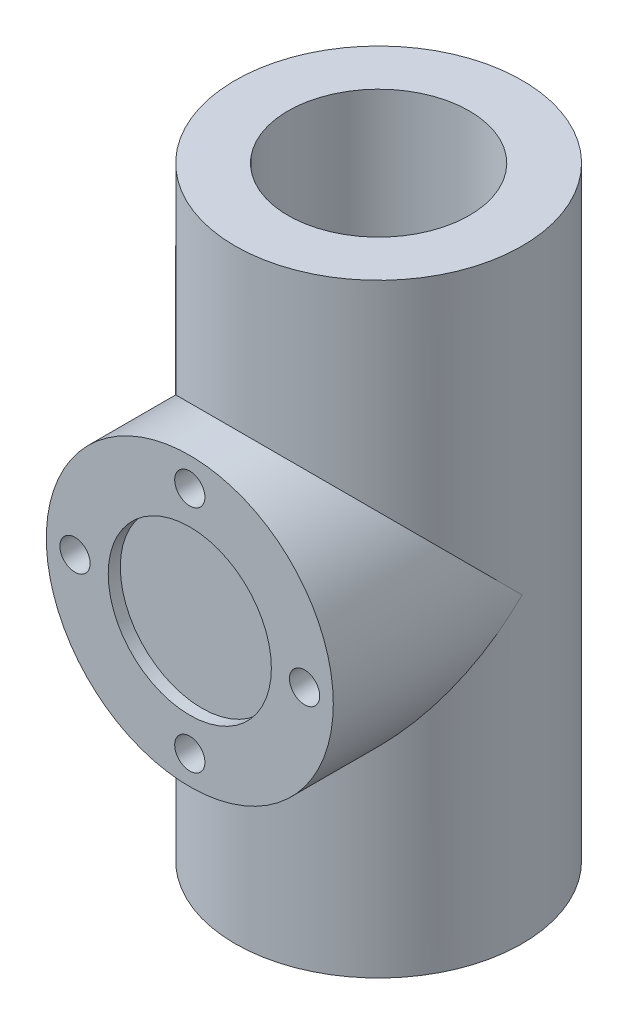
ISO-10303-21;
HEADER;
FILE_DESCRIPTION(('STEP AP214'),'2;1');
FILE_NAME('part.step','',(''),(''),'','','');
FILE_SCHEMA(('AUTOMOTIVE_DESIGN { 1 0 10303 214 1 1 1 1 }'));
ENDSEC;
DATA;
#1=APPLICATION_CONTEXT('core data for automotive mechanical design processes');
#2=APPLICATION_PROTOCOL_DEFINITION('international standard','automotive_design',2000,#1);
#3=PRODUCT_CONTEXT('',#1,'mechanical');
#4=PRODUCT('Part','Part','',(#3));
#5=PRODUCT_RELATED_PRODUCT_CATEGORY('part','',(#4));
#6=PRODUCT_DEFINITION_FORMATION('','',#4);
#7=PRODUCT_DEFINITION_CONTEXT('part definition',#1,'design');
#8=PRODUCT_DEFINITION('design','',#6,#7);
#9=PRODUCT_DEFINITION_SHAPE('','',#8);
#10=(LENGTH_UNIT() NAMED_UNIT(*) SI_UNIT(.MILLI.,.METRE.));
#11=(NAMED_UNIT(*) PLANE_ANGLE_UNIT() SI_UNIT($,.RADIAN.));
#12=(NAMED_UNIT(*) SI_UNIT($,.STERADIAN.) SOLID_ANGLE_UNIT());
#13=UNCERTAINTY_MEASURE_WITH_UNIT(LENGTH_MEASURE(1.E-05),#10,'distance_accuracy_value','');
#14=(GEOMETRIC_REPRESENTATION_CONTEXT(3) GLOBAL_UNCERTAINTY_ASSIGNED_CONTEXT((#13)) GLOBAL_UNIT_ASSIGNED_CONTEXT((#10,
#11,#12)) REPRESENTATION_CONTEXT('',''));
#15=CARTESIAN_POINT('',(0.,0.,0.));
#16=DIRECTION('',(0.,0.,1.));
#17=DIRECTION('',(1.,0.,0.));
#18=AXIS2_PLACEMENT_3D('',#15,#16,#17);
#19=CARTESIAN_POINT('',(0.,100.,0.));
#20=DIRECTION('',(0.,-1.,0.));
#21=DIRECTION('',(0.,0.,-1.));
#22=AXIS2_PLACEMENT_3D('',#19,#20,#21);
#23=CYLINDRICAL_SURFACE('',#22,47.5);
#24=CARTESIAN_POINT('',(0.,0.,0.));
#25=DIRECTION('',(0.,0.707106781186547,0.707106781186547));
#26=DIRECTION('',(0.,-0.707106781186547,0.707106781186547));
#27=AXIS2_PLACEMENT_3D('',#24,#25,#26);
#28=ELLIPSE('',#27,67.175144212722,47.5);
#29=CARTESIAN_POINT('',(-47.5,0.,0.));
#30=VERTEX_POINT('',#29);
#31=CARTESIAN_POINT('',(47.5,0.,0.));
#32=VERTEX_POINT('',#31);
#33=EDGE_CURVE('E60',#30,#32,#28,.T.);
#34=ORIENTED_EDGE('',*,*,#33,.F.);
#35=CARTESIAN_POINT('',(0.,0.,0.));
#36=DIRECTION('',(0.,-0.707106781186547,0.707106781186547));
#37=DIRECTION('',(0.,0.707106781186547,0.707106781186547));
#38=AXIS2_PLACEMENT_3D('',#35,#36,#37);
#39=ELLIPSE('',#38,67.175144212722,47.5);
#40=EDGE_CURVE('E58',#32,#30,#39,.T.);
#41=ORIENTED_EDGE('',*,*,#40,.F.);
#42=EDGE_LOOP('',(#34,#41));
#43=FACE_BOUND('',#42,.T.);
#44=CARTESIAN_POINT('',(0.,100.,0.));
#45=DIRECTION('',(0.,1.,0.));
#46=DIRECTION('',(0.,0.,1.));
#47=AXIS2_PLACEMENT_3D('',#44,#45,#46);
#48=CIRCLE('',#47,47.5);
#49=CARTESIAN_POINT('',(0.,100.,47.5));
#50=VERTEX_POINT('',#49);
#51=EDGE_CURVE('E11',#50,#50,#48,.T.);
#52=ORIENTED_EDGE('',*,*,#51,.F.);
#53=EDGE_LOOP('',(#52));
#54=FACE_BOUND('',#53,.T.);
#55=CARTESIAN_POINT('',(0.,-100.,0.));
#56=DIRECTION('',(0.,1.,0.));
#57=DIRECTION('',(0.,0.,1.));
#58=AXIS2_PLACEMENT_3D('',#55,#56,#57);
#59=CIRCLE('',#58,47.5);
#60=CARTESIAN_POINT('',(0.,-100.,47.5));
#61=VERTEX_POINT('',#60);
#62=EDGE_CURVE('E47',#61,#61,#59,.T.);
#63=ORIENTED_EDGE('',*,*,#62,.T.);
#64=EDGE_LOOP('',(#63));
#65=FACE_BOUND('',#64,.T.);
#66=ADVANCED_FACE('F44',(#43,#54,#65),#23,.T.);
#67=CARTESIAN_POINT('',(0.,100.,0.));
#68=DIRECTION('',(0.,1.,0.));
#69=DIRECTION('',(0.,0.,1.));
#70=AXIS2_PLACEMENT_3D('',#67,#68,#69);
#71=PLANE('',#70);
#72=CARTESIAN_POINT('',(0.,100.,0.));
#73=DIRECTION('',(0.,-1.,0.));
#74=DIRECTION('',(0.,0.,-1.));
#75=AXIS2_PLACEMENT_3D('',#72,#73,#74);
#76=CIRCLE('',#75,30.);
#77=CARTESIAN_POINT('',(0.,100.,-30.));
#78=VERTEX_POINT('',#77);
#79=EDGE_CURVE('E64',#78,#78,#76,.T.);
#80=ORIENTED_EDGE('',*,*,#79,.T.);
#81=EDGE_LOOP('',(#80));
#82=FACE_BOUND('',#81,.T.);
#83=ORIENTED_EDGE('',*,*,#51,.T.);
#84=EDGE_LOOP('',(#83));
#85=FACE_BOUND('',#84,.T.);
#86=ADVANCED_FACE('F154',(#82,#85),#71,.T.);
#87=CARTESIAN_POINT('',(0.,-100.,0.));
#88=DIRECTION('',(0.,1.,0.));
#89=DIRECTION('',(0.,0.,1.));
#90=AXIS2_PLACEMENT_3D('',#87,#88,#89);
#91=PLANE('',#90);
#92=CARTESIAN_POINT('',(0.,-100.,0.));
#93=DIRECTION('',(0.,-1.,0.));
#94=DIRECTION('',(0.,0.,-1.));
#95=AXIS2_PLACEMENT_3D('',#92,#93,#94);
#96=CIRCLE('',#95,30.);
#97=CARTESIAN_POINT('',(0.,-100.,-30.));
#98=VERTEX_POINT('',#97);
#99=EDGE_CURVE('E74',#98,#98,#96,.T.);
#100=ORIENTED_EDGE('',*,*,#99,.F.);
#101=EDGE_LOOP('',(#100));
#102=FACE_BOUND('',#101,.T.);
#103=ORIENTED_EDGE('',*,*,#62,.F.);
#104=EDGE_LOOP('',(#103));
#105=FACE_BOUND('',#104,.T.);
#106=ADVANCED_FACE('F147',(#102,#105),#91,.F.);
#107=CARTESIAN_POINT('',(0.,0.,-47.501));
#108=DIRECTION('',(0.,0.,1.));
#109=DIRECTION('',(1.,0.,0.));
#110=AXIS2_PLACEMENT_3D('',#107,#108,#109);
#111=CYLINDRICAL_SURFACE('',#110,47.5);
#112=CARTESIAN_POINT('',(0.,0.,62.5));
#113=DIRECTION('',(0.,0.,1.));
#114=DIRECTION('',(1.,0.,0.));
#115=AXIS2_PLACEMENT_3D('',#112,#113,#114);
#116=CIRCLE('',#115,47.5);
#117=CARTESIAN_POINT('',(47.5,0.,62.5));
#118=VERTEX_POINT('',#117);
#119=EDGE_CURVE('E68',#118,#118,#116,.T.);
#120=ORIENTED_EDGE('',*,*,#119,.F.);
#121=EDGE_LOOP('',(#120));
#122=FACE_BOUND('',#121,.T.);
#123=ORIENTED_EDGE('',*,*,#33,.T.);
#124=ORIENTED_EDGE('',*,*,#40,.T.);
#125=EDGE_LOOP('',(#123,#124));
#126=FACE_BOUND('',#125,.T.);
#127=ADVANCED_FACE('F61',(#122,#126),#111,.T.);
#128=CARTESIAN_POINT('',(0.,0.,62.5));
#129=DIRECTION('',(0.,0.,1.));
#130=DIRECTION('',(1.,0.,0.));
#131=AXIS2_PLACEMENT_3D('',#128,#129,#130);
#132=PLANE('',#131);
#133=CARTESIAN_POINT('',(0.,38.,62.5));
#134=DIRECTION('',(0.,0.,1.));
#135=DIRECTION('',(1.,0.,0.));
#136=AXIS2_PLACEMENT_3D('',#133,#134,#135);
#137=CIRCLE('',#136,5.);
#138=CARTESIAN_POINT('',(5.,38.,62.5));
#139=VERTEX_POINT('',#138);
#140=EDGE_CURVE('E114',#139,#139,#137,.T.);
#141=ORIENTED_EDGE('',*,*,#140,.F.);
#142=EDGE_LOOP('',(#141));
#143=FACE_BOUND('',#142,.T.);
#144=CARTESIAN_POINT('',(38.001,0.000999999999867324,62.5));
#145=DIRECTION('',(0.,0.,1.));
#146=DIRECTION('',(1.,0.,0.));
#147=AXIS2_PLACEMENT_3D('',#144,#145,#146);
#148=CIRCLE('',#147,5.);
#149=CARTESIAN_POINT('',(43.001,0.000999999999867324,62.5));
#150=VERTEX_POINT('',#149);
#151=EDGE_CURVE('E110',#150,#150,#148,.T.);
#152=ORIENTED_EDGE('',*,*,#151,.F.);
#153=EDGE_LOOP('',(#152));
#154=FACE_BOUND('',#153,.T.);
#155=CARTESIAN_POINT('',(0.00199999999973465,-38.,62.5));
#156=DIRECTION('',(0.,0.,1.));
#157=DIRECTION('',(1.,0.,0.));
#158=AXIS2_PLACEMENT_3D('',#155,#156,#157);
#159=CIRCLE('',#158,5.);
#160=CARTESIAN_POINT('',(5.00199999999973,-38.,62.5));
#161=VERTEX_POINT('',#160);
#162=EDGE_CURVE('E102',#161,#161,#159,.T.);
#163=ORIENTED_EDGE('',*,*,#162,.F.);
#164=EDGE_LOOP('',(#163));
#165=FACE_BOUND('',#164,.T.);
#166=CARTESIAN_POINT('',(-37.999,-0.000999999999601971,62.5));
#167=DIRECTION('',(0.,0.,1.));
#168=DIRECTION('',(1.,0.,0.));
#169=AXIS2_PLACEMENT_3D('',#166,#167,#168);
#170=CIRCLE('',#169,5.);
#171=CARTESIAN_POINT('',(-32.999,-0.000999999999601971,62.5));
#172=VERTEX_POINT('',#171);
#173=EDGE_CURVE('E94',#172,#172,#170,.T.);
#174=ORIENTED_EDGE('',*,*,#173,.F.);
#175=EDGE_LOOP('',(#174));
#176=FACE_BOUND('',#175,.T.);
#177=CARTESIAN_POINT('',(0.,0.,62.5));
#178=DIRECTION('',(0.,0.,1.));
#179=DIRECTION('',(1.,0.,0.));
#180=AXIS2_PLACEMENT_3D('',#177,#178,#179);
#181=CIRCLE('',#180,27.);
#182=CARTESIAN_POINT('',(27.,0.,62.5));
#183=VERTEX_POINT('',#182);
#184=EDGE_CURVE('E82',#183,#183,#181,.T.);
#185=ORIENTED_EDGE('',*,*,#184,.F.);
#186=EDGE_LOOP('',(#185));
#187=FACE_BOUND('',#186,.T.);
#188=ORIENTED_EDGE('',*,*,#119,.T.);
#189=EDGE_LOOP('',(#188));
#190=FACE_BOUND('',#189,.T.);
#191=ADVANCED_FACE('F131',(#143,#154,#165,#176,#187,#190),#132,.T.);
#192=CARTESIAN_POINT('',(0.,100.,0.));
#193=DIRECTION('',(0.,-1.,0.));
#194=DIRECTION('',(0.,0.,-1.));
#195=AXIS2_PLACEMENT_3D('',#192,#193,#194);
#196=CYLINDRICAL_SURFACE('',#195,30.);
#197=ORIENTED_EDGE('',*,*,#79,.F.);
#198=EDGE_LOOP('',(#197));
#199=FACE_BOUND('',#198,.T.);
#200=ORIENTED_EDGE('',*,*,#99,.T.);
#201=EDGE_LOOP('',(#200));
#202=FACE_BOUND('',#201,.T.);
#203=ADVANCED_FACE('F134',(#199,#202),#196,.F.);
#204=CARTESIAN_POINT('',(0.,0.,58.5));
#205=DIRECTION('',(0.,0.,1.));
#206=DIRECTION('',(1.,0.,0.));
#207=AXIS2_PLACEMENT_3D('',#204,#205,#206);
#208=CYLINDRICAL_SURFACE('',#207,27.);
#209=CARTESIAN_POINT('',(0.,0.,58.5));
#210=DIRECTION('',(0.,0.,1.));
#211=DIRECTION('',(1.,0.,0.));
#212=AXIS2_PLACEMENT_3D('',#209,#210,#211);
#213=CIRCLE('',#212,27.);
#214=CARTESIAN_POINT('',(27.,0.,58.5));
#215=VERTEX_POINT('',#214);
#216=EDGE_CURVE('E78',#215,#215,#213,.T.);
#217=ORIENTED_EDGE('',*,*,#216,.F.);
#218=EDGE_LOOP('',(#217));
#219=FACE_BOUND('',#218,.T.);
#220=ORIENTED_EDGE('',*,*,#184,.T.);
#221=EDGE_LOOP('',(#220));
#222=FACE_BOUND('',#221,.T.);
#223=ADVANCED_FACE('F173',(#219,#222),#208,.F.);
#224=CARTESIAN_POINT('',(0.,0.,58.5));
#225=DIRECTION('',(0.,0.,1.));
#226=DIRECTION('',(1.,0.,0.));
#227=AXIS2_PLACEMENT_3D('',#224,#225,#226);
#228=PLANE('',#227);
#229=ORIENTED_EDGE('',*,*,#216,.T.);
#230=EDGE_LOOP('',(#229));
#231=FACE_BOUND('',#230,.T.);
#232=ADVANCED_FACE('F179',(#231),#228,.T.);
#233=CARTESIAN_POINT('',(-37.999,-0.000999999999601971,42.5));
#234=DIRECTION('',(0.,0.,1.));
#235=DIRECTION('',(1.,0.,0.));
#236=AXIS2_PLACEMENT_3D('',#233,#234,#235);
#237=CYLINDRICAL_SURFACE('',#236,5.);
#238=CARTESIAN_POINT('',(-37.999,-0.000999999999601971,42.5));
#239=DIRECTION('',(0.,0.,1.));
#240=DIRECTION('',(1.,0.,0.));
#241=AXIS2_PLACEMENT_3D('',#238,#239,#240);
#242=CIRCLE('',#241,5.);
#243=CARTESIAN_POINT('',(-32.999,-0.000999999999601971,42.5));
#244=VERTEX_POINT('',#243);
#245=EDGE_CURVE('E90',#244,#244,#242,.T.);
#246=ORIENTED_EDGE('',*,*,#245,.F.);
#247=EDGE_LOOP('',(#246));
#248=FACE_BOUND('',#247,.T.);
#249=ORIENTED_EDGE('',*,*,#173,.T.);
#250=EDGE_LOOP('',(#249));
#251=FACE_BOUND('',#250,.T.);
#252=ADVANCED_FACE('F185',(#248,#251),#237,.F.);
#253=CARTESIAN_POINT('',(-37.999,-0.000999999999601971,42.5));
#254=DIRECTION('',(0.,0.,1.));
#255=DIRECTION('',(1.,0.,0.));
#256=AXIS2_PLACEMENT_3D('',#253,#254,#255);
#257=PLANE('',#256);
#258=ORIENTED_EDGE('',*,*,#245,.T.);
#259=EDGE_LOOP('',(#258));
#260=FACE_BOUND('',#259,.T.);
#261=ADVANCED_FACE('F187',(#260),#257,.T.);
#262=CARTESIAN_POINT('',(0.00199999999973465,-38.,42.5));
#263=DIRECTION('',(0.,0.,1.));
#264=DIRECTION('',(1.,0.,0.));
#265=AXIS2_PLACEMENT_3D('',#262,#263,#264);
#266=CYLINDRICAL_SURFACE('',#265,5.);
#267=CARTESIAN_POINT('',(0.00199999999973465,-38.,42.5));
#268=DIRECTION('',(0.,0.,1.));
#269=DIRECTION('',(1.,0.,0.));
#270=AXIS2_PLACEMENT_3D('',#267,#268,#269);
#271=CIRCLE('',#270,5.);
#272=CARTESIAN_POINT('',(5.00199999999973,-38.,42.5));
#273=VERTEX_POINT('',#272);
#274=EDGE_CURVE('E98',#273,#273,#271,.T.);
#275=ORIENTED_EDGE('',*,*,#274,.F.);
#276=EDGE_LOOP('',(#275));
#277=FACE_BOUND('',#276,.T.);
#278=ORIENTED_EDGE('',*,*,#162,.T.);
#279=EDGE_LOOP('',(#278));
#280=FACE_BOUND('',#279,.T.);
#281=ADVANCED_FACE('F190',(#277,#280),#266,.F.);
#282=CARTESIAN_POINT('',(0.00199999999973465,-38.,42.5));
#283=DIRECTION('',(0.,0.,1.));
#284=DIRECTION('',(1.,0.,0.));
#285=AXIS2_PLACEMENT_3D('',#282,#283,#284);
#286=PLANE('',#285);
#287=ORIENTED_EDGE('',*,*,#274,.T.);
#288=EDGE_LOOP('',(#287));
#289=FACE_BOUND('',#288,.T.);
#290=ADVANCED_FACE('F195',(#289),#286,.T.);
#291=CARTESIAN_POINT('',(38.001,0.000999999999867324,42.5));
#292=DIRECTION('',(0.,0.,1.));
#293=DIRECTION('',(1.,0.,0.));
#294=AXIS2_PLACEMENT_3D('',#291,#292,#293);
#295=CYLINDRICAL_SURFACE('',#294,5.);
#296=CARTESIAN_POINT('',(38.001,0.000999999999867324,42.5));
#297=DIRECTION('',(0.,0.,1.));
#298=DIRECTION('',(1.,0.,0.));
#299=AXIS2_PLACEMENT_3D('',#296,#297,#298);
#300=CIRCLE('',#299,5.);
#301=CARTESIAN_POINT('',(43.001,0.000999999999867324,42.5));
#302=VERTEX_POINT('',#301);
#303=EDGE_CURVE('E106',#302,#302,#300,.T.);
#304=ORIENTED_EDGE('',*,*,#303,.F.);
#305=EDGE_LOOP('',(#304));
#306=FACE_BOUND('',#305,.T.);
#307=ORIENTED_EDGE('',*,*,#151,.T.);
#308=EDGE_LOOP('',(#307));
#309=FACE_BOUND('',#308,.T.);
#310=ADVANCED_FACE('F198',(#306,#309),#295,.F.);
#311=CARTESIAN_POINT('',(38.001,0.000999999999867324,42.5));
#312=DIRECTION('',(0.,0.,1.));
#313=DIRECTION('',(1.,0.,0.));
#314=AXIS2_PLACEMENT_3D('',#311,#312,#313);
#315=PLANE('',#314);
#316=ORIENTED_EDGE('',*,*,#303,.T.);
#317=EDGE_LOOP('',(#316));
#318=FACE_BOUND('',#317,.T.);
#319=ADVANCED_FACE('F127',(#318),#315,.T.);
#320=CARTESIAN_POINT('',(0.,38.,42.5));
#321=DIRECTION('',(0.,0.,1.));
#322=DIRECTION('',(1.,0.,0.));
#323=AXIS2_PLACEMENT_3D('',#320,#321,#322);
#324=CYLINDRICAL_SURFACE('',#323,5.);
#325=CARTESIAN_POINT('',(0.,38.,42.5));
#326=DIRECTION('',(0.,0.,1.));
#327=DIRECTION('',(1.,0.,0.));
#328=AXIS2_PLACEMENT_3D('',#325,#326,#327);
#329=CIRCLE('',#328,5.);
#330=CARTESIAN_POINT('',(5.,38.,42.5));
#331=VERTEX_POINT('',#330);
#332=EDGE_CURVE('E86',#331,#331,#329,.T.);
#333=ORIENTED_EDGE('',*,*,#332,.F.);
#334=EDGE_LOOP('',(#333));
#335=FACE_BOUND('',#334,.T.);
#336=ORIENTED_EDGE('',*,*,#140,.T.);
#337=EDGE_LOOP('',(#336));
#338=FACE_BOUND('',#337,.T.);
#339=ADVANCED_FACE('F124',(#335,#338),#324,.F.);
#340=CARTESIAN_POINT('',(0.,38.,42.5));
#341=DIRECTION('',(0.,0.,1.));
#342=DIRECTION('',(1.,0.,0.));
#343=AXIS2_PLACEMENT_3D('',#340,#341,#342);
#344=PLANE('',#343);
#345=ORIENTED_EDGE('',*,*,#332,.T.);
#346=EDGE_LOOP('',(#345));
#347=FACE_BOUND('',#346,.T.);
#348=ADVANCED_FACE('F122',(#347),#344,.T.);
#349=CLOSED_SHELL('',(#66,#86,#106,#127,#191,#203,#223,#232,#252,#261,#281,#290,#310,#319,#339,#348));
#350=MANIFOLD_SOLID_BREP('B2',#349);
#351=ADVANCED_BREP_SHAPE_REPRESENTATION('',(#18,#350),#14);
#352=SHAPE_DEFINITION_REPRESENTATION(#9,#351);
ENDSEC;
END-ISO-10303-21;
